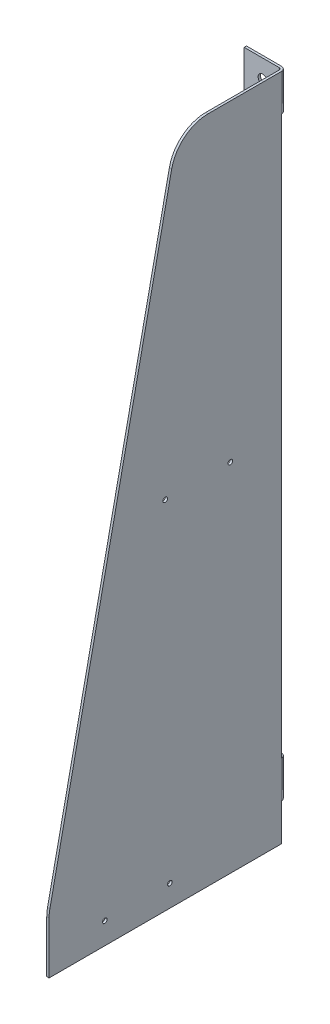
ISO-10303-21;
HEADER;
FILE_DESCRIPTION(('STEP AP214'),'2;1');
FILE_NAME('part.step','',(''),(''),'','','');
FILE_SCHEMA(('AUTOMOTIVE_DESIGN { 1 0 10303 214 1 1 1 1 }'));
ENDSEC;
DATA;
#1=APPLICATION_CONTEXT('core data for automotive mechanical design processes');
#2=APPLICATION_PROTOCOL_DEFINITION('international standard','automotive_design',2000,#1);
#3=PRODUCT_CONTEXT('',#1,'mechanical');
#4=PRODUCT('Part','Part','',(#3));
#5=PRODUCT_RELATED_PRODUCT_CATEGORY('part','',(#4));
#6=PRODUCT_DEFINITION_FORMATION('','',#4);
#7=PRODUCT_DEFINITION_CONTEXT('part definition',#1,'design');
#8=PRODUCT_DEFINITION('design','',#6,#7);
#9=PRODUCT_DEFINITION_SHAPE('','',#8);
#10=(LENGTH_UNIT() NAMED_UNIT(*) SI_UNIT(.MILLI.,.METRE.));
#11=(NAMED_UNIT(*) PLANE_ANGLE_UNIT() SI_UNIT($,.RADIAN.));
#12=(NAMED_UNIT(*) SI_UNIT($,.STERADIAN.) SOLID_ANGLE_UNIT());
#13=UNCERTAINTY_MEASURE_WITH_UNIT(LENGTH_MEASURE(1.E-05),#10,'distance_accuracy_value','');
#14=(GEOMETRIC_REPRESENTATION_CONTEXT(3) GLOBAL_UNCERTAINTY_ASSIGNED_CONTEXT((#13)) GLOBAL_UNIT_ASSIGNED_CONTEXT((#10,
#11,#12)) REPRESENTATION_CONTEXT('',''));
#15=CARTESIAN_POINT('',(0.,0.,0.));
#16=DIRECTION('',(0.,0.,1.));
#17=DIRECTION('',(1.,0.,0.));
#18=AXIS2_PLACEMENT_3D('',#15,#16,#17);
#19=CARTESIAN_POINT('',(0.,0.,0.));
#20=DIRECTION('',(1.,0.,0.));
#21=DIRECTION('',(0.,0.,-1.));
#22=AXIS2_PLACEMENT_3D('',#19,#20,#21);
#23=PLANE('',#22);
#24=CARTESIAN_POINT('',(0.,486.804131036418,69.85));
#25=DIRECTION('',(1.,0.,0.));
#26=DIRECTION('',(0.,0.,-1.));
#27=AXIS2_PLACEMENT_3D('',#24,#25,#26);
#28=CIRCLE('',#27,3.175);
#29=CARTESIAN_POINT('',(0.,486.804131036418,66.675));
#30=VERTEX_POINT('',#29);
#31=EDGE_CURVE('E235',#30,#30,#28,.T.);
#32=ORIENTED_EDGE('',*,*,#31,.T.);
#33=EDGE_LOOP('',(#32));
#34=FACE_BOUND('',#33,.T.);
#35=CARTESIAN_POINT('',(0.,29.604131036418,152.4));
#36=DIRECTION('',(1.,0.,0.));
#37=DIRECTION('',(0.,0.,-1.));
#38=AXIS2_PLACEMENT_3D('',#35,#36,#37);
#39=CIRCLE('',#38,3.175);
#40=CARTESIAN_POINT('',(0.,29.604131036418,149.225));
#41=VERTEX_POINT('',#40);
#42=EDGE_CURVE('E288',#41,#41,#39,.T.);
#43=ORIENTED_EDGE('',*,*,#42,.T.);
#44=EDGE_LOOP('',(#43));
#45=FACE_BOUND('',#44,.T.);
#46=CARTESIAN_POINT('',(0.,486.804131036418,158.75));
#47=DIRECTION('',(1.,0.,0.));
#48=DIRECTION('',(0.,0.,-1.));
#49=AXIS2_PLACEMENT_3D('',#46,#47,#48);
#50=CIRCLE('',#49,3.17499999999997);
#51=CARTESIAN_POINT('',(0.,486.804131036418,155.575));
#52=VERTEX_POINT('',#51);
#53=EDGE_CURVE('E292',#52,#52,#50,.T.);
#54=ORIENTED_EDGE('',*,*,#53,.T.);
#55=EDGE_LOOP('',(#54));
#56=FACE_BOUND('',#55,.T.);
#57=CARTESIAN_POINT('',(0.,29.604131036418,241.3));
#58=DIRECTION('',(1.,0.,0.));
#59=DIRECTION('',(0.,0.,-1.));
#60=AXIS2_PLACEMENT_3D('',#57,#58,#59);
#61=CIRCLE('',#60,3.17499999999997);
#62=CARTESIAN_POINT('',(0.,29.604131036418,238.125));
#63=VERTEX_POINT('',#62);
#64=EDGE_CURVE('E241',#63,#63,#61,.T.);
#65=ORIENTED_EDGE('',*,*,#64,.T.);
#66=EDGE_LOOP('',(#65));
#67=FACE_BOUND('',#66,.T.);
#68=DIRECTION('',(0.,0.,-1.));
#69=VECTOR('',#68,1.);
#70=CARTESIAN_POINT('',(0.,914.4,0.));
#71=LINE('',#70,#69);
#72=CARTESIAN_POINT('',(0.,914.4,100.150182784968));
#73=VERTEX_POINT('',#72);
#74=CARTESIAN_POINT('',(0.,914.4,0.));
#75=VERTEX_POINT('',#74);
#76=EDGE_CURVE('E324',#73,#75,#71,.T.);
#77=ORIENTED_EDGE('',*,*,#76,.T.);
#78=DIRECTION('',(0.,1.,0.));
#79=VECTOR('',#78,1.);
#80=CARTESIAN_POINT('',(0.,863.6,0.));
#81=LINE('',#80,#79);
#82=CARTESIAN_POINT('',(0.,863.6,0.));
#83=VERTEX_POINT('',#82);
#84=EDGE_CURVE('E397',#75,#83,#81,.F.);
#85=ORIENTED_EDGE('',*,*,#84,.T.);
#86=DIRECTION('',(0.,-1.,0.));
#87=VECTOR('',#86,1.);
#88=CARTESIAN_POINT('',(0.,0.,-1.05760497574365E-13));
#89=LINE('',#88,#87);
#90=CARTESIAN_POINT('',(0.,101.6,0.));
#91=VERTEX_POINT('',#90);
#92=EDGE_CURVE('E320',#83,#91,#89,.T.);
#93=ORIENTED_EDGE('',*,*,#92,.T.);
#94=DIRECTION('',(0.,1.,0.));
#95=VECTOR('',#94,1.);
#96=CARTESIAN_POINT('',(0.,50.8,0.));
#97=LINE('',#96,#95);
#98=CARTESIAN_POINT('',(0.,50.8,0.));
#99=VERTEX_POINT('',#98);
#100=EDGE_CURVE('E394',#91,#99,#97,.F.);
#101=ORIENTED_EDGE('',*,*,#100,.T.);
#102=DIRECTION('',(0.,1.,0.));
#103=VECTOR('',#102,1.);
#104=CARTESIAN_POINT('',(0.,0.,0.));
#105=LINE('',#104,#103);
#106=CARTESIAN_POINT('',(0.,0.,0.));
#107=VERTEX_POINT('',#106);
#108=EDGE_CURVE('E316',#107,#99,#105,.T.);
#109=ORIENTED_EDGE('',*,*,#108,.F.);
#110=DIRECTION('',(0.,0.,1.));
#111=VECTOR('',#110,1.);
#112=CARTESIAN_POINT('',(0.,0.,0.));
#113=LINE('',#112,#111);
#114=CARTESIAN_POINT('',(0.,0.,317.5));
#115=VERTEX_POINT('',#114);
#116=EDGE_CURVE('E312',#107,#115,#113,.T.);
#117=ORIENTED_EDGE('',*,*,#116,.T.);
#118=DIRECTION('',(0.,1.,0.));
#119=VECTOR('',#118,1.);
#120=CARTESIAN_POINT('',(0.,0.,317.5));
#121=LINE('',#120,#119);
#122=CARTESIAN_POINT('',(0.,70.9208405371646,317.5));
#123=VERTEX_POINT('',#122);
#124=EDGE_CURVE('E308',#115,#123,#121,.T.);
#125=ORIENTED_EDGE('',*,*,#124,.T.);
#126=CARTESIAN_POINT('',(0.,70.9208405371646,266.7));
#127=DIRECTION('',(1.,0.,0.));
#128=DIRECTION('',(0.,0.,-1.));
#129=AXIS2_PLACEMENT_3D('',#126,#127,#128);
#130=CIRCLE('',#129,50.8);
#131=CARTESIAN_POINT('',(0.,81.3663535379903,316.414497464518));
#132=VERTEX_POINT('',#131);
#133=EDGE_CURVE('E304',#123,#132,#130,.F.);
#134=ORIENTED_EDGE('',*,*,#133,.T.);
#135=DIRECTION('',(0.,-0.97863183985272,0.205620334661924));
#136=VECTOR('',#135,1.);
#137=CARTESIAN_POINT('',(0.,67.1111623571902,319.409655665897));
#138=LINE('',#137,#136);
#139=CARTESIAN_POINT('',(0.,874.045513000825,149.864680249487));
#140=VERTEX_POINT('',#139);
#141=EDGE_CURVE('E300',#140,#132,#138,.T.);
#142=ORIENTED_EDGE('',*,*,#141,.F.);
#143=CARTESIAN_POINT('',(0.,863.6,100.150182784968));
#144=DIRECTION('',(1.,0.,0.));
#145=DIRECTION('',(0.,0.,-1.));
#146=AXIS2_PLACEMENT_3D('',#143,#144,#145);
#147=CIRCLE('',#146,50.8);
#148=EDGE_CURVE('E296',#140,#73,#147,.F.);
#149=ORIENTED_EDGE('',*,*,#148,.T.);
#150=EDGE_LOOP('',(#77,#85,#93,#101,#109,#117,#125,#134,#142,#149));
#151=FACE_BOUND('',#150,.T.);
#152=ADVANCED_FACE('F49',(#34,#45,#56,#67,#151),#23,.F.);
#153=CARTESIAN_POINT('',(3.175,863.6,100.150182784968));
#154=DIRECTION('',(-1.,0.,0.));
#155=DIRECTION('',(0.,0.,1.));
#156=AXIS2_PLACEMENT_3D('',#153,#154,#155);
#157=CYLINDRICAL_SURFACE('',#156,50.8);
#158=ORIENTED_EDGE('',*,*,#148,.F.);
#159=DIRECTION('',(-1.,0.,0.));
#160=VECTOR('',#159,1.);
#161=CARTESIAN_POINT('',(3.175,874.045513000825,149.864680249487));
#162=LINE('',#161,#160);
#163=CARTESIAN_POINT('',(3.175,874.045513000825,149.864680249487));
#164=VERTEX_POINT('',#163);
#165=EDGE_CURVE('E363',#164,#140,#162,.T.);
#166=ORIENTED_EDGE('',*,*,#165,.F.);
#167=CARTESIAN_POINT('',(3.175,863.6,100.150182784968));
#168=DIRECTION('',(1.,0.,0.));
#169=DIRECTION('',(0.,0.,-1.));
#170=AXIS2_PLACEMENT_3D('',#167,#168,#169);
#171=CIRCLE('',#170,50.8);
#172=CARTESIAN_POINT('',(3.175,914.4,100.150182784968));
#173=VERTEX_POINT('',#172);
#174=EDGE_CURVE('E249',#164,#173,#171,.F.);
#175=ORIENTED_EDGE('',*,*,#174,.T.);
#176=DIRECTION('',(-1.,0.,0.));
#177=VECTOR('',#176,1.);
#178=CARTESIAN_POINT('',(3.175,914.4,100.150182784968));
#179=LINE('',#178,#177);
#180=EDGE_CURVE('E284',#173,#73,#179,.T.);
#181=ORIENTED_EDGE('',*,*,#180,.T.);
#182=EDGE_LOOP('',(#158,#166,#175,#181));
#183=FACE_BOUND('',#182,.T.);
#184=ADVANCED_FACE('F487',(#183),#157,.T.);
#185=CARTESIAN_POINT('',(3.175,67.1111623571902,319.409655665897));
#186=DIRECTION('',(0.,-0.205620334661924,-0.978631839852719));
#187=DIRECTION('',(0.,0.97863183985272,-0.205620334661924));
#188=AXIS2_PLACEMENT_3D('',#185,#186,#187);
#189=PLANE('',#188);
#190=ORIENTED_EDGE('',*,*,#141,.T.);
#191=DIRECTION('',(-1.,0.,0.));
#192=VECTOR('',#191,1.);
#193=CARTESIAN_POINT('',(3.175,81.3663535379903,316.414497464518));
#194=LINE('',#193,#192);
#195=CARTESIAN_POINT('',(3.175,81.3663535379903,316.414497464518));
#196=VERTEX_POINT('',#195);
#197=EDGE_CURVE('E360',#196,#132,#194,.T.);
#198=ORIENTED_EDGE('',*,*,#197,.F.);
#199=DIRECTION('',(0.,-0.97863183985272,0.205620334661924));
#200=VECTOR('',#199,1.);
#201=CARTESIAN_POINT('',(3.175,67.1111623571902,319.409655665897));
#202=LINE('',#201,#200);
#203=EDGE_CURVE('E253',#164,#196,#202,.T.);
#204=ORIENTED_EDGE('',*,*,#203,.F.);
#205=ORIENTED_EDGE('',*,*,#165,.T.);
#206=EDGE_LOOP('',(#190,#198,#204,#205));
#207=FACE_BOUND('',#206,.T.);
#208=ADVANCED_FACE('F522',(#207),#189,.F.);
#209=CARTESIAN_POINT('',(3.175,70.9208405371646,266.7));
#210=DIRECTION('',(-1.,0.,0.));
#211=DIRECTION('',(0.,0.,1.));
#212=AXIS2_PLACEMENT_3D('',#209,#210,#211);
#213=CYLINDRICAL_SURFACE('',#212,50.8);
#214=ORIENTED_EDGE('',*,*,#133,.F.);
#215=DIRECTION('',(-1.,0.,0.));
#216=VECTOR('',#215,1.);
#217=CARTESIAN_POINT('',(3.175,70.9208405371646,317.5));
#218=LINE('',#217,#216);
#219=CARTESIAN_POINT('',(3.175,70.9208405371646,317.5));
#220=VERTEX_POINT('',#219);
#221=EDGE_CURVE('E357',#220,#123,#218,.T.);
#222=ORIENTED_EDGE('',*,*,#221,.F.);
#223=CARTESIAN_POINT('',(3.175,70.9208405371646,266.7));
#224=DIRECTION('',(1.,0.,0.));
#225=DIRECTION('',(0.,0.,-1.));
#226=AXIS2_PLACEMENT_3D('',#223,#224,#225);
#227=CIRCLE('',#226,50.8);
#228=EDGE_CURVE('E256',#220,#196,#227,.F.);
#229=ORIENTED_EDGE('',*,*,#228,.T.);
#230=ORIENTED_EDGE('',*,*,#197,.T.);
#231=EDGE_LOOP('',(#214,#222,#229,#230));
#232=FACE_BOUND('',#231,.T.);
#233=ADVANCED_FACE('F559',(#232),#213,.T.);
#234=CARTESIAN_POINT('',(3.175,0.,317.5));
#235=DIRECTION('',(0.,0.,1.));
#236=DIRECTION('',(1.,0.,0.));
#237=AXIS2_PLACEMENT_3D('',#234,#235,#236);
#238=PLANE('',#237);
#239=ORIENTED_EDGE('',*,*,#124,.F.);
#240=DIRECTION('',(-1.,0.,0.));
#241=VECTOR('',#240,1.);
#242=CARTESIAN_POINT('',(3.175,0.,317.5));
#243=LINE('',#242,#241);
#244=CARTESIAN_POINT('',(3.175,0.,317.5));
#245=VERTEX_POINT('',#244);
#246=EDGE_CURVE('E354',#245,#115,#243,.T.);
#247=ORIENTED_EDGE('',*,*,#246,.F.);
#248=DIRECTION('',(0.,1.,0.));
#249=VECTOR('',#248,1.);
#250=CARTESIAN_POINT('',(3.175,0.,317.5));
#251=LINE('',#250,#249);
#252=EDGE_CURVE('E260',#245,#220,#251,.T.);
#253=ORIENTED_EDGE('',*,*,#252,.T.);
#254=ORIENTED_EDGE('',*,*,#221,.T.);
#255=EDGE_LOOP('',(#239,#247,#253,#254));
#256=FACE_BOUND('',#255,.T.);
#257=ADVANCED_FACE('F555',(#256),#238,.T.);
#258=CARTESIAN_POINT('',(3.175,0.,0.));
#259=DIRECTION('',(0.,-1.,0.));
#260=DIRECTION('',(0.,0.,-1.));
#261=AXIS2_PLACEMENT_3D('',#258,#259,#260);
#262=PLANE('',#261);
#263=ORIENTED_EDGE('',*,*,#116,.F.);
#264=DIRECTION('',(-1.,0.,0.));
#265=VECTOR('',#264,1.);
#266=CARTESIAN_POINT('',(3.175,0.,0.));
#267=LINE('',#266,#265);
#268=CARTESIAN_POINT('',(3.175,0.,0.));
#269=VERTEX_POINT('',#268);
#270=EDGE_CURVE('E351',#269,#107,#267,.T.);
#271=ORIENTED_EDGE('',*,*,#270,.F.);
#272=DIRECTION('',(0.,0.,1.));
#273=VECTOR('',#272,1.);
#274=CARTESIAN_POINT('',(3.175,0.,0.));
#275=LINE('',#274,#273);
#276=EDGE_CURVE('E264',#269,#245,#275,.T.);
#277=ORIENTED_EDGE('',*,*,#276,.T.);
#278=ORIENTED_EDGE('',*,*,#246,.T.);
#279=EDGE_LOOP('',(#263,#271,#277,#278));
#280=FACE_BOUND('',#279,.T.);
#281=ADVANCED_FACE('F551',(#280),#262,.T.);
#282=CARTESIAN_POINT('',(3.175,0.,0.));
#283=DIRECTION('',(0.,0.,1.));
#284=DIRECTION('',(1.,0.,0.));
#285=AXIS2_PLACEMENT_3D('',#282,#283,#284);
#286=PLANE('',#285);
#287=ORIENTED_EDGE('',*,*,#108,.T.);
#288=DIRECTION('',(-1.,0.,0.));
#289=VECTOR('',#288,1.);
#290=CARTESIAN_POINT('',(3.175,50.8,0.));
#291=LINE('',#290,#289);
#292=CARTESIAN_POINT('',(3.175,50.8,0.));
#293=VERTEX_POINT('',#292);
#294=EDGE_CURVE('E348',#293,#99,#291,.T.);
#295=ORIENTED_EDGE('',*,*,#294,.F.);
#296=DIRECTION('',(0.,1.,0.));
#297=VECTOR('',#296,1.);
#298=CARTESIAN_POINT('',(3.175,0.,0.));
#299=LINE('',#298,#297);
#300=EDGE_CURVE('E268',#269,#293,#299,.T.);
#301=ORIENTED_EDGE('',*,*,#300,.F.);
#302=ORIENTED_EDGE('',*,*,#270,.T.);
#303=EDGE_LOOP('',(#287,#295,#301,#302));
#304=FACE_BOUND('',#303,.T.);
#305=ADVANCED_FACE('F549',(#304),#286,.F.);
#306=CARTESIAN_POINT('',(3.175,50.8,0.));
#307=DIRECTION('',(0.,-1.,0.));
#308=DIRECTION('',(0.,0.,-1.));
#309=AXIS2_PLACEMENT_3D('',#306,#307,#308);
#310=PLANE('',#309);
#311=DIRECTION('',(-1.,0.,0.));
#312=VECTOR('',#311,1.);
#313=CARTESIAN_POINT('',(3.175,50.8,-6.35));
#314=LINE('',#313,#312);
#315=CARTESIAN_POINT('',(-3.175,50.8,-6.35));
#316=VERTEX_POINT('',#315);
#317=CARTESIAN_POINT('',(-50.8,50.8,-6.35));
#318=VERTEX_POINT('',#317);
#319=EDGE_CURVE('E188',#316,#318,#314,.T.);
#320=ORIENTED_EDGE('',*,*,#319,.F.);
#321=CARTESIAN_POINT('',(-3.175,50.8,0.));
#322=DIRECTION('',(0.,-1.,0.));
#323=DIRECTION('',(0.,0.,-1.));
#324=AXIS2_PLACEMENT_3D('',#321,#322,#323);
#325=CIRCLE('',#324,6.35);
#326=EDGE_CURVE('E369',#316,#293,#325,.T.);
#327=ORIENTED_EDGE('',*,*,#326,.T.);
#328=ORIENTED_EDGE('',*,*,#294,.T.);
#329=CARTESIAN_POINT('',(-3.175,50.8,0.));
#330=DIRECTION('',(0.,-1.,0.));
#331=DIRECTION('',(0.,0.,-1.));
#332=AXIS2_PLACEMENT_3D('',#329,#330,#331);
#333=CIRCLE('',#332,3.175);
#334=CARTESIAN_POINT('',(-3.175,50.8,-3.175));
#335=VERTEX_POINT('',#334);
#336=EDGE_CURVE('E11',#99,#335,#333,.F.);
#337=ORIENTED_EDGE('',*,*,#336,.T.);
#338=DIRECTION('',(1.,0.,0.));
#339=VECTOR('',#338,1.);
#340=CARTESIAN_POINT('',(-50.8,50.8,-3.175));
#341=LINE('',#340,#339);
#342=CARTESIAN_POINT('',(-50.8,50.8,-3.175));
#343=VERTEX_POINT('',#342);
#344=EDGE_CURVE('E422',#343,#335,#341,.T.);
#345=ORIENTED_EDGE('',*,*,#344,.F.);
#346=DIRECTION('',(0.,0.,1.));
#347=VECTOR('',#346,1.);
#348=CARTESIAN_POINT('',(-50.8,50.8,-6.35));
#349=LINE('',#348,#347);
#350=EDGE_CURVE('E206',#318,#343,#349,.T.);
#351=ORIENTED_EDGE('',*,*,#350,.F.);
#352=EDGE_LOOP('',(#320,#327,#328,#337,#345,#351));
#353=FACE_BOUND('',#352,.T.);
#354=ADVANCED_FACE('F545',(#353),#310,.T.);
#355=CARTESIAN_POINT('',(3.175,0.,-6.35000000000001));
#356=DIRECTION('',(0.,0.,-1.));
#357=DIRECTION('',(0.,1.,0.));
#358=AXIS2_PLACEMENT_3D('',#355,#356,#357);
#359=PLANE('',#358);
#360=CARTESIAN_POINT('',(-25.4,76.2,-6.35));
#361=DIRECTION('',(0.,0.,1.));
#362=DIRECTION('',(1.,0.,0.));
#363=AXIS2_PLACEMENT_3D('',#360,#361,#362);
#364=CIRCLE('',#363,6.35);
#365=CARTESIAN_POINT('',(-19.05,76.2,-6.35));
#366=VERTEX_POINT('',#365);
#367=EDGE_CURVE('E424',#366,#366,#364,.T.);
#368=ORIENTED_EDGE('',*,*,#367,.T.);
#369=EDGE_LOOP('',(#368));
#370=FACE_BOUND('',#369,.T.);
#371=DIRECTION('',(-1.,0.,0.));
#372=VECTOR('',#371,1.);
#373=CARTESIAN_POINT('',(3.175,101.6,-6.34999999999999));
#374=LINE('',#373,#372);
#375=CARTESIAN_POINT('',(-3.175,101.6,-6.34999999999999));
#376=VERTEX_POINT('',#375);
#377=CARTESIAN_POINT('',(-50.8,101.6,-6.35));
#378=VERTEX_POINT('',#377);
#379=EDGE_CURVE('E175',#376,#378,#374,.T.);
#380=ORIENTED_EDGE('',*,*,#379,.F.);
#381=DIRECTION('',(0.,-1.,0.));
#382=VECTOR('',#381,1.);
#383=CARTESIAN_POINT('',(-3.175,0.,-6.35000000000001));
#384=LINE('',#383,#382);
#385=EDGE_CURVE('E366',#376,#316,#384,.T.);
#386=ORIENTED_EDGE('',*,*,#385,.T.);
#387=ORIENTED_EDGE('',*,*,#319,.T.);
#388=DIRECTION('',(0.,-1.,0.));
#389=VECTOR('',#388,1.);
#390=CARTESIAN_POINT('',(-50.8,50.8,-6.35));
#391=LINE('',#390,#389);
#392=EDGE_CURVE('E194',#378,#318,#391,.T.);
#393=ORIENTED_EDGE('',*,*,#392,.F.);
#394=EDGE_LOOP('',(#380,#386,#387,#393));
#395=FACE_BOUND('',#394,.T.);
#396=ADVANCED_FACE('F201',(#370,#395),#359,.T.);
#397=CARTESIAN_POINT('',(3.175,101.6,0.));
#398=DIRECTION('',(0.,1.,0.));
#399=DIRECTION('',(0.,0.,1.));
#400=AXIS2_PLACEMENT_3D('',#397,#398,#399);
#401=PLANE('',#400);
#402=DIRECTION('',(-1.,0.,0.));
#403=VECTOR('',#402,1.);
#404=CARTESIAN_POINT('',(3.175,101.6,0.));
#405=LINE('',#404,#403);
#406=CARTESIAN_POINT('',(3.175,101.6,0.));
#407=VERTEX_POINT('',#406);
#408=EDGE_CURVE('E189',#407,#91,#405,.T.);
#409=ORIENTED_EDGE('',*,*,#408,.F.);
#410=CARTESIAN_POINT('',(-3.175,101.6,0.));
#411=DIRECTION('',(0.,1.,0.));
#412=DIRECTION('',(0.,0.,1.));
#413=AXIS2_PLACEMENT_3D('',#410,#411,#412);
#414=CIRCLE('',#413,6.35);
#415=EDGE_CURVE('E182',#407,#376,#414,.T.);
#416=ORIENTED_EDGE('',*,*,#415,.T.);
#417=ORIENTED_EDGE('',*,*,#379,.T.);
#418=DIRECTION('',(0.,0.,-1.));
#419=VECTOR('',#418,1.);
#420=CARTESIAN_POINT('',(-50.8,101.6,-6.35));
#421=LINE('',#420,#419);
#422=CARTESIAN_POINT('',(-50.8,101.6,-3.175));
#423=VERTEX_POINT('',#422);
#424=EDGE_CURVE('E180',#423,#378,#421,.T.);
#425=ORIENTED_EDGE('',*,*,#424,.F.);
#426=DIRECTION('',(1.,0.,0.));
#427=VECTOR('',#426,1.);
#428=CARTESIAN_POINT('',(-50.8,101.6,-3.175));
#429=LINE('',#428,#427);
#430=CARTESIAN_POINT('',(-3.175,101.6,-3.175));
#431=VERTEX_POINT('',#430);
#432=EDGE_CURVE('E199',#423,#431,#429,.T.);
#433=ORIENTED_EDGE('',*,*,#432,.T.);
#434=CARTESIAN_POINT('',(-3.175,101.6,0.));
#435=DIRECTION('',(0.,1.,0.));
#436=DIRECTION('',(0.,0.,1.));
#437=AXIS2_PLACEMENT_3D('',#434,#435,#436);
#438=CIRCLE('',#437,3.175);
#439=EDGE_CURVE('E58',#431,#91,#438,.F.);
#440=ORIENTED_EDGE('',*,*,#439,.T.);
#441=EDGE_LOOP('',(#409,#416,#417,#425,#433,#440));
#442=FACE_BOUND('',#441,.T.);
#443=ADVANCED_FACE('F178',(#442),#401,.T.);
#444=CARTESIAN_POINT('',(3.175,0.,-1.05760497574365E-13));
#445=DIRECTION('',(0.,0.,-1.));
#446=DIRECTION('',(0.,1.,0.));
#447=AXIS2_PLACEMENT_3D('',#444,#445,#446);
#448=PLANE('',#447);
#449=ORIENTED_EDGE('',*,*,#92,.F.);
#450=DIRECTION('',(-1.,0.,0.));
#451=VECTOR('',#450,1.);
#452=CARTESIAN_POINT('',(3.175,863.6,0.));
#453=LINE('',#452,#451);
#454=CARTESIAN_POINT('',(3.175,863.6,0.));
#455=VERTEX_POINT('',#454);
#456=EDGE_CURVE('E339',#455,#83,#453,.T.);
#457=ORIENTED_EDGE('',*,*,#456,.F.);
#458=DIRECTION('',(0.,-1.,0.));
#459=VECTOR('',#458,1.);
#460=CARTESIAN_POINT('',(3.175,0.,-1.05760497574365E-13));
#461=LINE('',#460,#459);
#462=EDGE_CURVE('E272',#455,#407,#461,.T.);
#463=ORIENTED_EDGE('',*,*,#462,.T.);
#464=ORIENTED_EDGE('',*,*,#408,.T.);
#465=EDGE_LOOP('',(#449,#457,#463,#464));
#466=FACE_BOUND('',#465,.T.);
#467=ADVANCED_FACE('F413',(#466),#448,.T.);
#468=CARTESIAN_POINT('',(3.175,863.6,0.));
#469=DIRECTION('',(0.,-1.,0.));
#470=DIRECTION('',(0.,0.,-1.));
#471=AXIS2_PLACEMENT_3D('',#468,#469,#470);
#472=PLANE('',#471);
#473=DIRECTION('',(-1.,0.,0.));
#474=VECTOR('',#473,1.);
#475=CARTESIAN_POINT('',(3.175,863.6,-6.35));
#476=LINE('',#475,#474);
#477=CARTESIAN_POINT('',(-3.175,863.6,-6.35));
#478=VERTEX_POINT('',#477);
#479=CARTESIAN_POINT('',(-50.8,863.6,-6.34999999999999));
#480=VERTEX_POINT('',#479);
#481=EDGE_CURVE('E336',#478,#480,#476,.T.);
#482=ORIENTED_EDGE('',*,*,#481,.F.);
#483=CARTESIAN_POINT('',(-3.175,863.6,0.));
#484=DIRECTION('',(0.,-1.,0.));
#485=DIRECTION('',(0.,0.,-1.));
#486=AXIS2_PLACEMENT_3D('',#483,#484,#485);
#487=CIRCLE('',#486,6.35);
#488=EDGE_CURVE('E384',#478,#455,#487,.T.);
#489=ORIENTED_EDGE('',*,*,#488,.T.);
#490=ORIENTED_EDGE('',*,*,#456,.T.);
#491=CARTESIAN_POINT('',(-3.175,863.6,0.));
#492=DIRECTION('',(0.,-1.,0.));
#493=DIRECTION('',(0.,0.,-1.));
#494=AXIS2_PLACEMENT_3D('',#491,#492,#493);
#495=CIRCLE('',#494,3.175);
#496=CARTESIAN_POINT('',(-3.175,863.6,-3.17499999999999));
#497=VERTEX_POINT('',#496);
#498=EDGE_CURVE('E406',#83,#497,#495,.F.);
#499=ORIENTED_EDGE('',*,*,#498,.T.);
#500=DIRECTION('',(1.,0.,0.));
#501=VECTOR('',#500,1.);
#502=CARTESIAN_POINT('',(-50.8,863.6,-3.17499999999999));
#503=LINE('',#502,#501);
#504=CARTESIAN_POINT('',(-50.8,863.6,-3.17499999999999));
#505=VERTEX_POINT('',#504);
#506=EDGE_CURVE('E231',#505,#497,#503,.T.);
#507=ORIENTED_EDGE('',*,*,#506,.F.);
#508=DIRECTION('',(0.,0.,1.));
#509=VECTOR('',#508,1.);
#510=CARTESIAN_POINT('',(-50.8,863.6,-6.34999999999999));
#511=LINE('',#510,#509);
#512=EDGE_CURVE('E213',#480,#505,#511,.T.);
#513=ORIENTED_EDGE('',*,*,#512,.F.);
#514=EDGE_LOOP('',(#482,#489,#490,#499,#507,#513));
#515=FACE_BOUND('',#514,.T.);
#516=ADVANCED_FACE('F502',(#515),#472,.T.);
#517=CARTESIAN_POINT('',(3.175,0.,-6.35000000000009));
#518=DIRECTION('',(0.,0.,-1.));
#519=DIRECTION('',(0.,1.,0.));
#520=AXIS2_PLACEMENT_3D('',#517,#518,#519);
#521=PLANE('',#520);
#522=CARTESIAN_POINT('',(-25.4,889.,-6.35));
#523=DIRECTION('',(0.,0.,1.));
#524=DIRECTION('',(1.,0.,0.));
#525=AXIS2_PLACEMENT_3D('',#522,#523,#524);
#526=CIRCLE('',#525,6.35);
#527=CARTESIAN_POINT('',(-19.05,889.,-6.35));
#528=VERTEX_POINT('',#527);
#529=EDGE_CURVE('E450',#528,#528,#526,.T.);
#530=ORIENTED_EDGE('',*,*,#529,.T.);
#531=EDGE_LOOP('',(#530));
#532=FACE_BOUND('',#531,.T.);
#533=DIRECTION('',(-1.,0.,0.));
#534=VECTOR('',#533,1.);
#535=CARTESIAN_POINT('',(3.175,914.4,-6.34999999999999));
#536=LINE('',#535,#534);
#537=CARTESIAN_POINT('',(-3.175,914.4,-6.34999999999999));
#538=VERTEX_POINT('',#537);
#539=CARTESIAN_POINT('',(-50.8,914.4,-6.34999999999999));
#540=VERTEX_POINT('',#539);
#541=EDGE_CURVE('E333',#538,#540,#536,.T.);
#542=ORIENTED_EDGE('',*,*,#541,.F.);
#543=DIRECTION('',(0.,-1.,0.));
#544=VECTOR('',#543,1.);
#545=CARTESIAN_POINT('',(-3.175,0.,-6.35000000000009));
#546=LINE('',#545,#544);
#547=EDGE_CURVE('E380',#538,#478,#546,.T.);
#548=ORIENTED_EDGE('',*,*,#547,.T.);
#549=ORIENTED_EDGE('',*,*,#481,.T.);
#550=DIRECTION('',(0.,-1.,0.));
#551=VECTOR('',#550,1.);
#552=CARTESIAN_POINT('',(-50.8,914.4,-6.34999999999999));
#553=LINE('',#552,#551);
#554=EDGE_CURVE('E205',#540,#480,#553,.T.);
#555=ORIENTED_EDGE('',*,*,#554,.F.);
#556=EDGE_LOOP('',(#542,#548,#549,#555));
#557=FACE_BOUND('',#556,.T.);
#558=ADVANCED_FACE('F500',(#532,#557),#521,.T.);
#559=CARTESIAN_POINT('',(3.175,914.4,0.));
#560=DIRECTION('',(0.,1.,0.));
#561=DIRECTION('',(0.,0.,1.));
#562=AXIS2_PLACEMENT_3D('',#559,#560,#561);
#563=PLANE('',#562);
#564=DIRECTION('',(0.,0.,-1.));
#565=VECTOR('',#564,1.);
#566=CARTESIAN_POINT('',(3.175,914.4,0.));
#567=LINE('',#566,#565);
#568=CARTESIAN_POINT('',(3.175,914.4,0.));
#569=VERTEX_POINT('',#568);
#570=EDGE_CURVE('E276',#173,#569,#567,.T.);
#571=ORIENTED_EDGE('',*,*,#570,.T.);
#572=CARTESIAN_POINT('',(-3.175,914.4,0.));
#573=DIRECTION('',(0.,1.,0.));
#574=DIRECTION('',(0.,0.,1.));
#575=AXIS2_PLACEMENT_3D('',#572,#573,#574);
#576=CIRCLE('',#575,6.35);
#577=EDGE_CURVE('E387',#569,#538,#576,.T.);
#578=ORIENTED_EDGE('',*,*,#577,.T.);
#579=ORIENTED_EDGE('',*,*,#541,.T.);
#580=DIRECTION('',(0.,0.,-1.));
#581=VECTOR('',#580,1.);
#582=CARTESIAN_POINT('',(-50.8,914.4,-6.34999999999999));
#583=LINE('',#582,#581);
#584=CARTESIAN_POINT('',(-50.8,914.4,-3.17499999999999));
#585=VERTEX_POINT('',#584);
#586=EDGE_CURVE('E223',#585,#540,#583,.T.);
#587=ORIENTED_EDGE('',*,*,#586,.F.);
#588=DIRECTION('',(1.,0.,0.));
#589=VECTOR('',#588,1.);
#590=CARTESIAN_POINT('',(-50.8,914.4,-3.17499999999999));
#591=LINE('',#590,#589);
#592=CARTESIAN_POINT('',(-3.175,914.4,-3.17499999999999));
#593=VERTEX_POINT('',#592);
#594=EDGE_CURVE('E227',#585,#593,#591,.T.);
#595=ORIENTED_EDGE('',*,*,#594,.T.);
#596=CARTESIAN_POINT('',(-3.175,914.4,0.));
#597=DIRECTION('',(0.,1.,0.));
#598=DIRECTION('',(0.,0.,1.));
#599=AXIS2_PLACEMENT_3D('',#596,#597,#598);
#600=CIRCLE('',#599,3.175);
#601=EDGE_CURVE('E403',#593,#75,#600,.F.);
#602=ORIENTED_EDGE('',*,*,#601,.T.);
#603=ORIENTED_EDGE('',*,*,#76,.F.);
#604=ORIENTED_EDGE('',*,*,#180,.F.);
#605=EDGE_LOOP('',(#571,#578,#579,#587,#595,#602,#603,#604));
#606=FACE_BOUND('',#605,.T.);
#607=ADVANCED_FACE('F482',(#606),#563,.T.);
#608=CARTESIAN_POINT('',(3.175,486.804131036418,158.75));
#609=DIRECTION('',(-1.,0.,0.));
#610=DIRECTION('',(0.,0.,1.));
#611=AXIS2_PLACEMENT_3D('',#608,#609,#610);
#612=CYLINDRICAL_SURFACE('',#611,3.17499999999997);
#613=CARTESIAN_POINT('',(3.175,486.804131036418,158.75));
#614=DIRECTION('',(1.,0.,0.));
#615=DIRECTION('',(0.,0.,-1.));
#616=AXIS2_PLACEMENT_3D('',#613,#614,#615);
#617=CIRCLE('',#616,3.17499999999997);
#618=CARTESIAN_POINT('',(3.175,486.804131036418,155.575));
#619=VERTEX_POINT('',#618);
#620=EDGE_CURVE('E245',#619,#619,#617,.T.);
#621=ORIENTED_EDGE('',*,*,#620,.T.);
#622=EDGE_LOOP('',(#621));
#623=FACE_BOUND('',#622,.T.);
#624=ORIENTED_EDGE('',*,*,#53,.F.);
#625=EDGE_LOOP('',(#624));
#626=FACE_BOUND('',#625,.T.);
#627=ADVANCED_FACE('F533',(#623,#626),#612,.F.);
#628=CARTESIAN_POINT('',(3.175,29.604131036418,152.4));
#629=DIRECTION('',(-1.,0.,0.));
#630=DIRECTION('',(0.,0.,1.));
#631=AXIS2_PLACEMENT_3D('',#628,#629,#630);
#632=CYLINDRICAL_SURFACE('',#631,3.175);
#633=CARTESIAN_POINT('',(3.175,29.604131036418,152.4));
#634=DIRECTION('',(1.,0.,0.));
#635=DIRECTION('',(0.,0.,-1.));
#636=AXIS2_PLACEMENT_3D('',#633,#634,#635);
#637=CIRCLE('',#636,3.175);
#638=CARTESIAN_POINT('',(3.175,29.604131036418,149.225));
#639=VERTEX_POINT('',#638);
#640=EDGE_CURVE('E240',#639,#639,#637,.T.);
#641=ORIENTED_EDGE('',*,*,#640,.T.);
#642=EDGE_LOOP('',(#641));
#643=FACE_BOUND('',#642,.T.);
#644=ORIENTED_EDGE('',*,*,#42,.F.);
#645=EDGE_LOOP('',(#644));
#646=FACE_BOUND('',#645,.T.);
#647=ADVANCED_FACE('F569',(#643,#646),#632,.F.);
#648=CARTESIAN_POINT('',(3.175,486.804131036418,69.85));
#649=DIRECTION('',(-1.,0.,0.));
#650=DIRECTION('',(0.,0.,1.));
#651=AXIS2_PLACEMENT_3D('',#648,#649,#650);
#652=CYLINDRICAL_SURFACE('',#651,3.175);
#653=CARTESIAN_POINT('',(3.175,486.804131036418,69.85));
#654=DIRECTION('',(1.,0.,0.));
#655=DIRECTION('',(0.,0.,-1.));
#656=AXIS2_PLACEMENT_3D('',#653,#654,#655);
#657=CIRCLE('',#656,3.175);
#658=CARTESIAN_POINT('',(3.175,486.804131036418,66.675));
#659=VERTEX_POINT('',#658);
#660=EDGE_CURVE('E236',#659,#659,#657,.T.);
#661=ORIENTED_EDGE('',*,*,#660,.T.);
#662=EDGE_LOOP('',(#661));
#663=FACE_BOUND('',#662,.T.);
#664=ORIENTED_EDGE('',*,*,#31,.F.);
#665=EDGE_LOOP('',(#664));
#666=FACE_BOUND('',#665,.T.);
#667=ADVANCED_FACE('F529',(#663,#666),#652,.F.);
#668=CARTESIAN_POINT('',(3.175,29.604131036418,241.3));
#669=DIRECTION('',(-1.,0.,0.));
#670=DIRECTION('',(0.,0.,1.));
#671=AXIS2_PLACEMENT_3D('',#668,#669,#670);
#672=CYLINDRICAL_SURFACE('',#671,3.17499999999997);
#673=CARTESIAN_POINT('',(3.175,29.604131036418,241.3));
#674=DIRECTION('',(1.,0.,0.));
#675=DIRECTION('',(0.,0.,-1.));
#676=AXIS2_PLACEMENT_3D('',#673,#674,#675);
#677=CIRCLE('',#676,3.17499999999997);
#678=CARTESIAN_POINT('',(3.175,29.604131036418,238.125));
#679=VERTEX_POINT('',#678);
#680=EDGE_CURVE('E280',#679,#679,#677,.T.);
#681=ORIENTED_EDGE('',*,*,#680,.T.);
#682=EDGE_LOOP('',(#681));
#683=FACE_BOUND('',#682,.T.);
#684=ORIENTED_EDGE('',*,*,#64,.F.);
#685=EDGE_LOOP('',(#684));
#686=FACE_BOUND('',#685,.T.);
#687=ADVANCED_FACE('F527',(#683,#686),#672,.F.);
#688=CARTESIAN_POINT('',(3.175,0.,0.));
#689=DIRECTION('',(1.,0.,0.));
#690=DIRECTION('',(0.,0.,-1.));
#691=AXIS2_PLACEMENT_3D('',#688,#689,#690);
#692=PLANE('',#691);
#693=ORIENTED_EDGE('',*,*,#660,.F.);
#694=EDGE_LOOP('',(#693));
#695=FACE_BOUND('',#694,.T.);
#696=ORIENTED_EDGE('',*,*,#640,.F.);
#697=EDGE_LOOP('',(#696));
#698=FACE_BOUND('',#697,.T.);
#699=ORIENTED_EDGE('',*,*,#620,.F.);
#700=EDGE_LOOP('',(#699));
#701=FACE_BOUND('',#700,.T.);
#702=ORIENTED_EDGE('',*,*,#300,.T.);
#703=DIRECTION('',(0.,-1.,0.));
#704=VECTOR('',#703,1.);
#705=CARTESIAN_POINT('',(3.175,0.,0.));
#706=LINE('',#705,#704);
#707=EDGE_CURVE('E375',#293,#407,#706,.F.);
#708=ORIENTED_EDGE('',*,*,#707,.T.);
#709=ORIENTED_EDGE('',*,*,#462,.F.);
#710=DIRECTION('',(0.,-1.,0.));
#711=VECTOR('',#710,1.);
#712=CARTESIAN_POINT('',(3.175,0.,0.));
#713=LINE('',#712,#711);
#714=EDGE_CURVE('E372',#455,#569,#713,.F.);
#715=ORIENTED_EDGE('',*,*,#714,.T.);
#716=ORIENTED_EDGE('',*,*,#570,.F.);
#717=ORIENTED_EDGE('',*,*,#174,.F.);
#718=ORIENTED_EDGE('',*,*,#203,.T.);
#719=ORIENTED_EDGE('',*,*,#228,.F.);
#720=ORIENTED_EDGE('',*,*,#252,.F.);
#721=ORIENTED_EDGE('',*,*,#276,.F.);
#722=EDGE_LOOP('',(#702,#708,#709,#715,#716,#717,#718,#719,#720,#721));
#723=FACE_BOUND('',#722,.T.);
#724=ORIENTED_EDGE('',*,*,#680,.F.);
#725=EDGE_LOOP('',(#724));
#726=FACE_BOUND('',#725,.T.);
#727=ADVANCED_FACE('F470',(#695,#698,#701,#723,#726),#692,.T.);
#728=CARTESIAN_POINT('',(-50.8,914.4,-3.17499999999999));
#729=DIRECTION('',(0.,0.,-1.));
#730=DIRECTION('',(0.,1.,0.));
#731=AXIS2_PLACEMENT_3D('',#728,#729,#730);
#732=PLANE('',#731);
#733=CARTESIAN_POINT('',(-25.4,889.,-3.17499999999989));
#734=DIRECTION('',(0.,0.,1.));
#735=DIRECTION('',(1.,0.,0.));
#736=AXIS2_PLACEMENT_3D('',#733,#734,#735);
#737=CIRCLE('',#736,6.35);
#738=CARTESIAN_POINT('',(-19.05,889.,-3.17499999999989));
#739=VERTEX_POINT('',#738);
#740=EDGE_CURVE('E455',#739,#739,#737,.T.);
#741=ORIENTED_EDGE('',*,*,#740,.F.);
#742=EDGE_LOOP('',(#741));
#743=FACE_BOUND('',#742,.T.);
#744=ORIENTED_EDGE('',*,*,#506,.T.);
#745=DIRECTION('',(0.,1.,0.));
#746=VECTOR('',#745,1.);
#747=CARTESIAN_POINT('',(-3.175,914.4,-3.17499999999999));
#748=LINE('',#747,#746);
#749=EDGE_CURVE('E390',#497,#593,#748,.T.);
#750=ORIENTED_EDGE('',*,*,#749,.T.);
#751=ORIENTED_EDGE('',*,*,#594,.F.);
#752=DIRECTION('',(0.,1.,0.));
#753=VECTOR('',#752,1.);
#754=CARTESIAN_POINT('',(-50.8,914.4,-3.17499999999999));
#755=LINE('',#754,#753);
#756=EDGE_CURVE('E220',#505,#585,#755,.T.);
#757=ORIENTED_EDGE('',*,*,#756,.F.);
#758=EDGE_LOOP('',(#744,#750,#751,#757));
#759=FACE_BOUND('',#758,.T.);
#760=ADVANCED_FACE('F466',(#743,#759),#732,.F.);
#761=CARTESIAN_POINT('',(-50.8,0.,0.));
#762=DIRECTION('',(-1.,0.,0.));
#763=DIRECTION('',(0.,0.,1.));
#764=AXIS2_PLACEMENT_3D('',#761,#762,#763);
#765=PLANE('',#764);
#766=ORIENTED_EDGE('',*,*,#554,.T.);
#767=ORIENTED_EDGE('',*,*,#512,.T.);
#768=ORIENTED_EDGE('',*,*,#756,.T.);
#769=ORIENTED_EDGE('',*,*,#586,.T.);
#770=EDGE_LOOP('',(#766,#767,#768,#769));
#771=FACE_BOUND('',#770,.T.);
#772=ADVANCED_FACE('F469',(#771),#765,.T.);
#773=CARTESIAN_POINT('',(-50.8,50.8,-3.175));
#774=DIRECTION('',(0.,0.,-1.));
#775=DIRECTION('',(-1.,0.,0.));
#776=AXIS2_PLACEMENT_3D('',#773,#774,#775);
#777=PLANE('',#776);
#778=CARTESIAN_POINT('',(-25.4,76.2,-3.17499999999989));
#779=DIRECTION('',(0.,0.,1.));
#780=DIRECTION('',(1.,0.,0.));
#781=AXIS2_PLACEMENT_3D('',#778,#779,#780);
#782=CIRCLE('',#781,6.35);
#783=CARTESIAN_POINT('',(-19.05,76.2,-3.17499999999989));
#784=VERTEX_POINT('',#783);
#785=EDGE_CURVE('E432',#784,#784,#782,.T.);
#786=ORIENTED_EDGE('',*,*,#785,.F.);
#787=EDGE_LOOP('',(#786));
#788=FACE_BOUND('',#787,.T.);
#789=ORIENTED_EDGE('',*,*,#344,.T.);
#790=DIRECTION('',(0.,1.,0.));
#791=VECTOR('',#790,1.);
#792=CARTESIAN_POINT('',(-3.175,101.6,-3.175));
#793=LINE('',#792,#791);
#794=EDGE_CURVE('E400',#335,#431,#793,.T.);
#795=ORIENTED_EDGE('',*,*,#794,.T.);
#796=ORIENTED_EDGE('',*,*,#432,.F.);
#797=DIRECTION('',(0.,1.,0.));
#798=VECTOR('',#797,1.);
#799=CARTESIAN_POINT('',(-50.8,50.8,-3.175));
#800=LINE('',#799,#798);
#801=EDGE_CURVE('E196',#343,#423,#800,.T.);
#802=ORIENTED_EDGE('',*,*,#801,.F.);
#803=EDGE_LOOP('',(#789,#795,#796,#802));
#804=FACE_BOUND('',#803,.T.);
#805=ADVANCED_FACE('F421',(#788,#804),#777,.F.);
#806=CARTESIAN_POINT('',(-50.8,0.,0.));
#807=DIRECTION('',(1.,0.,0.));
#808=DIRECTION('',(0.,0.,-1.));
#809=AXIS2_PLACEMENT_3D('',#806,#807,#808);
#810=PLANE('',#809);
#811=ORIENTED_EDGE('',*,*,#392,.T.);
#812=ORIENTED_EDGE('',*,*,#350,.T.);
#813=ORIENTED_EDGE('',*,*,#801,.T.);
#814=ORIENTED_EDGE('',*,*,#424,.T.);
#815=EDGE_LOOP('',(#811,#812,#813,#814));
#816=FACE_BOUND('',#815,.T.);
#817=ADVANCED_FACE('F193',(#816),#810,.F.);
#818=CARTESIAN_POINT('',(-3.175,0.,0.));
#819=DIRECTION('',(0.,-1.,0.));
#820=DIRECTION('',(0.,0.,-1.));
#821=AXIS2_PLACEMENT_3D('',#818,#819,#820);
#822=CYLINDRICAL_SURFACE('',#821,6.35);
#823=ORIENTED_EDGE('',*,*,#415,.F.);
#824=ORIENTED_EDGE('',*,*,#707,.F.);
#825=ORIENTED_EDGE('',*,*,#326,.F.);
#826=ORIENTED_EDGE('',*,*,#385,.F.);
#827=EDGE_LOOP('',(#823,#824,#825,#826));
#828=FACE_BOUND('',#827,.T.);
#829=ADVANCED_FACE('F577',(#828),#822,.T.);
#830=CARTESIAN_POINT('',(-3.175,0.,0.));
#831=DIRECTION('',(0.,-1.,0.));
#832=DIRECTION('',(0.,0.,-1.));
#833=AXIS2_PLACEMENT_3D('',#830,#831,#832);
#834=CYLINDRICAL_SURFACE('',#833,6.35);
#835=ORIENTED_EDGE('',*,*,#577,.F.);
#836=ORIENTED_EDGE('',*,*,#714,.F.);
#837=ORIENTED_EDGE('',*,*,#488,.F.);
#838=ORIENTED_EDGE('',*,*,#547,.F.);
#839=EDGE_LOOP('',(#835,#836,#837,#838));
#840=FACE_BOUND('',#839,.T.);
#841=ADVANCED_FACE('F497',(#840),#834,.T.);
#842=CARTESIAN_POINT('',(-25.4,76.2,-3.17499999999989));
#843=DIRECTION('',(0.,0.,1.));
#844=DIRECTION('',(1.,0.,0.));
#845=AXIS2_PLACEMENT_3D('',#842,#843,#844);
#846=CYLINDRICAL_SURFACE('',#845,6.35);
#847=ORIENTED_EDGE('',*,*,#367,.F.);
#848=EDGE_LOOP('',(#847));
#849=FACE_BOUND('',#848,.T.);
#850=ORIENTED_EDGE('',*,*,#785,.T.);
#851=EDGE_LOOP('',(#850));
#852=FACE_BOUND('',#851,.T.);
#853=ADVANCED_FACE('F582',(#849,#852),#846,.F.);
#854=CARTESIAN_POINT('',(-25.4,889.,-3.17499999999989));
#855=DIRECTION('',(0.,0.,1.));
#856=DIRECTION('',(1.,0.,0.));
#857=AXIS2_PLACEMENT_3D('',#854,#855,#856);
#858=CYLINDRICAL_SURFACE('',#857,6.35);
#859=ORIENTED_EDGE('',*,*,#529,.F.);
#860=EDGE_LOOP('',(#859));
#861=FACE_BOUND('',#860,.T.);
#862=ORIENTED_EDGE('',*,*,#740,.T.);
#863=EDGE_LOOP('',(#862));
#864=FACE_BOUND('',#863,.T.);
#865=ADVANCED_FACE('F464',(#861,#864),#858,.F.);
#866=CARTESIAN_POINT('',(-3.175,914.4,0.));
#867=DIRECTION('',(0.,-1.,0.));
#868=DIRECTION('',(0.,0.,-1.));
#869=AXIS2_PLACEMENT_3D('',#866,#867,#868);
#870=CYLINDRICAL_SURFACE('',#869,3.175);
#871=ORIENTED_EDGE('',*,*,#498,.F.);
#872=ORIENTED_EDGE('',*,*,#84,.F.);
#873=ORIENTED_EDGE('',*,*,#601,.F.);
#874=ORIENTED_EDGE('',*,*,#749,.F.);
#875=EDGE_LOOP('',(#871,#872,#873,#874));
#876=FACE_BOUND('',#875,.T.);
#877=ADVANCED_FACE('F479',(#876),#870,.F.);
#878=CARTESIAN_POINT('',(-3.175,50.8,0.));
#879=DIRECTION('',(0.,-1.,0.));
#880=DIRECTION('',(0.,0.,-1.));
#881=AXIS2_PLACEMENT_3D('',#878,#879,#880);
#882=CYLINDRICAL_SURFACE('',#881,3.175);
#883=ORIENTED_EDGE('',*,*,#336,.F.);
#884=ORIENTED_EDGE('',*,*,#100,.F.);
#885=ORIENTED_EDGE('',*,*,#439,.F.);
#886=ORIENTED_EDGE('',*,*,#794,.F.);
#887=EDGE_LOOP('',(#883,#884,#885,#886));
#888=FACE_BOUND('',#887,.T.);
#889=ADVANCED_FACE('F51',(#888),#882,.F.);
#890=CLOSED_SHELL('',(#152,#184,#208,#233,#257,#281,#305,#354,#396,#443,#467,#516,#558,#607,
#627,#647,#667,#687,#727,#760,#772,#805,#817,#829,#841,#853,#865,#877,#889));
#891=MANIFOLD_SOLID_BREP('B2',#890);
#892=ADVANCED_BREP_SHAPE_REPRESENTATION('',(#18,#891),#14);
#893=SHAPE_DEFINITION_REPRESENTATION(#9,#892);
ENDSEC;
END-ISO-10303-21;
